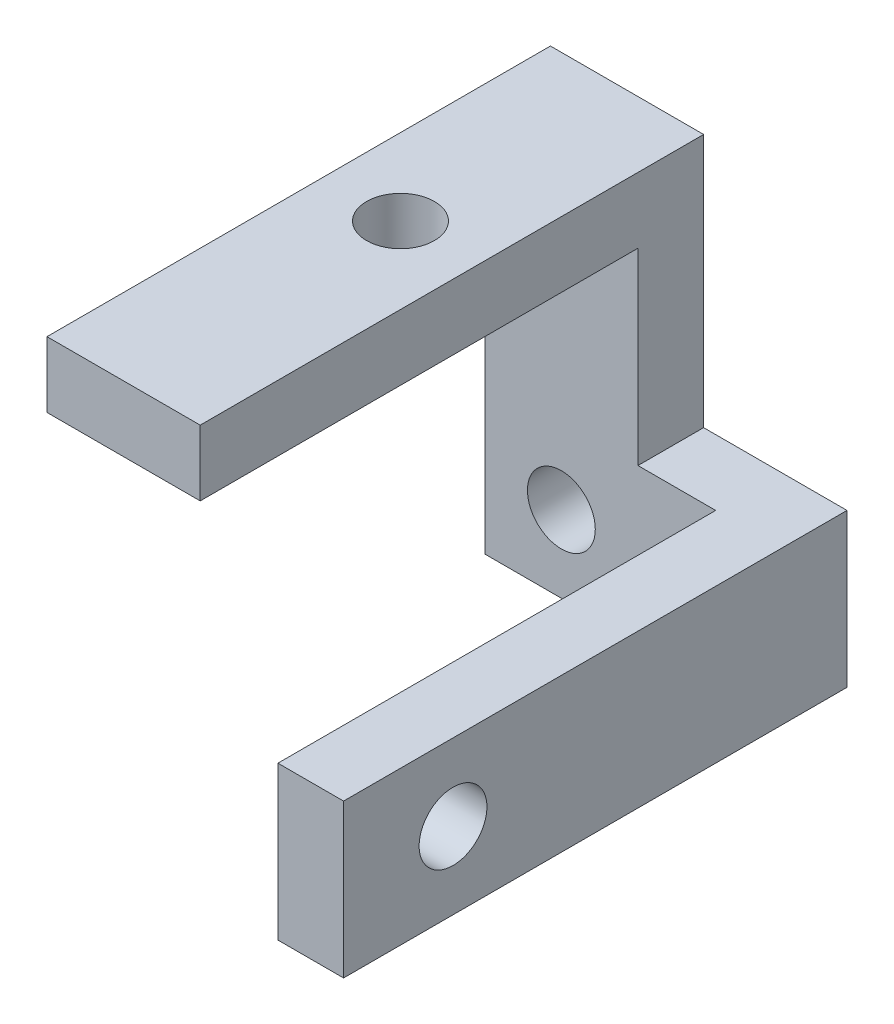
ISO-10303-21;
HEADER;
FILE_DESCRIPTION(('STEP AP214'),'2;1');
FILE_NAME('part.step','',(''),(''),'','','');
FILE_SCHEMA(('AUTOMOTIVE_DESIGN { 1 0 10303 214 1 1 1 1 }'));
ENDSEC;
DATA;
#1=APPLICATION_CONTEXT('core data for automotive mechanical design processes');
#2=APPLICATION_PROTOCOL_DEFINITION('international standard','automotive_design',2000,#1);
#3=PRODUCT_CONTEXT('',#1,'mechanical');
#4=PRODUCT('Part','Part','',(#3));
#5=PRODUCT_RELATED_PRODUCT_CATEGORY('part','',(#4));
#6=PRODUCT_DEFINITION_FORMATION('','',#4);
#7=PRODUCT_DEFINITION_CONTEXT('part definition',#1,'design');
#8=PRODUCT_DEFINITION('design','',#6,#7);
#9=PRODUCT_DEFINITION_SHAPE('','',#8);
#10=(LENGTH_UNIT() NAMED_UNIT(*) SI_UNIT(.MILLI.,.METRE.));
#11=(NAMED_UNIT(*) PLANE_ANGLE_UNIT() SI_UNIT($,.RADIAN.));
#12=(NAMED_UNIT(*) SI_UNIT($,.STERADIAN.) SOLID_ANGLE_UNIT());
#13=UNCERTAINTY_MEASURE_WITH_UNIT(LENGTH_MEASURE(1.E-05),#10,'distance_accuracy_value','');
#14=(GEOMETRIC_REPRESENTATION_CONTEXT(3) GLOBAL_UNCERTAINTY_ASSIGNED_CONTEXT((#13)) GLOBAL_UNIT_ASSIGNED_CONTEXT((#10,
#11,#12)) REPRESENTATION_CONTEXT('',''));
#15=CARTESIAN_POINT('',(0.,0.,0.));
#16=DIRECTION('',(0.,0.,1.));
#17=DIRECTION('',(1.,0.,0.));
#18=AXIS2_PLACEMENT_3D('',#15,#16,#17);
#19=CARTESIAN_POINT('',(0.,0.,3.));
#20=DIRECTION('',(0.,0.,1.));
#21=DIRECTION('',(1.,0.,0.));
#22=AXIS2_PLACEMENT_3D('',#19,#20,#21);
#23=PLANE('',#22);
#24=CARTESIAN_POINT('',(3.5,3.5,3.));
#25=DIRECTION('',(0.,0.,1.));
#26=DIRECTION('',(1.,0.,0.));
#27=AXIS2_PLACEMENT_3D('',#24,#25,#26);
#28=CIRCLE('',#27,1.55);
#29=CARTESIAN_POINT('',(5.05,3.5,3.));
#30=VERTEX_POINT('',#29);
#31=EDGE_CURVE('E384',#30,#30,#28,.T.);
#32=ORIENTED_EDGE('',*,*,#31,.F.);
#33=EDGE_LOOP('',(#32));
#34=FACE_BOUND('',#33,.T.);
#35=DIRECTION('',(1.,0.,0.));
#36=VECTOR('',#35,1.);
#37=CARTESIAN_POINT('',(0.,0.,3.));
#38=LINE('',#37,#36);
#39=CARTESIAN_POINT('',(0.,0.,3.));
#40=VERTEX_POINT('',#39);
#41=CARTESIAN_POINT('',(10.55,0.,3.));
#42=VERTEX_POINT('',#41);
#43=EDGE_CURVE('E56',#40,#42,#38,.T.);
#44=ORIENTED_EDGE('',*,*,#43,.T.);
#45=DIRECTION('',(0.,-1.,0.));
#46=VECTOR('',#45,1.);
#47=CARTESIAN_POINT('',(10.55,7.,3.));
#48=LINE('',#47,#46);
#49=CARTESIAN_POINT('',(10.55,7.,3.));
#50=VERTEX_POINT('',#49);
#51=EDGE_CURVE('E51',#50,#42,#48,.T.);
#52=ORIENTED_EDGE('',*,*,#51,.F.);
#53=DIRECTION('',(1.,0.,0.));
#54=VECTOR('',#53,1.);
#55=CARTESIAN_POINT('',(0.,7.,3.));
#56=LINE('',#55,#54);
#57=CARTESIAN_POINT('',(7.,7.,3.));
#58=VERTEX_POINT('',#57);
#59=EDGE_CURVE('E175',#58,#50,#56,.T.);
#60=ORIENTED_EDGE('',*,*,#59,.F.);
#61=DIRECTION('',(0.,1.,0.));
#62=VECTOR('',#61,1.);
#63=CARTESIAN_POINT('',(7.,0.,3.));
#64=LINE('',#63,#62);
#65=CARTESIAN_POINT('',(7.,15.6,3.));
#66=VERTEX_POINT('',#65);
#67=EDGE_CURVE('E177',#58,#66,#64,.T.);
#68=ORIENTED_EDGE('',*,*,#67,.T.);
#69=DIRECTION('',(1.,0.,0.));
#70=VECTOR('',#69,1.);
#71=CARTESIAN_POINT('',(0.,15.6,3.));
#72=LINE('',#71,#70);
#73=CARTESIAN_POINT('',(0.,15.6,3.));
#74=VERTEX_POINT('',#73);
#75=EDGE_CURVE('E149',#74,#66,#72,.T.);
#76=ORIENTED_EDGE('',*,*,#75,.F.);
#77=DIRECTION('',(0.,1.,0.));
#78=VECTOR('',#77,1.);
#79=CARTESIAN_POINT('',(0.,0.,3.));
#80=LINE('',#79,#78);
#81=EDGE_CURVE('E170',#40,#74,#80,.T.);
#82=ORIENTED_EDGE('',*,*,#81,.F.);
#83=EDGE_LOOP('',(#44,#52,#60,#68,#76,#82));
#84=FACE_BOUND('',#83,.T.);
#85=ADVANCED_FACE('F35',(#34,#84),#23,.T.);
#86=CARTESIAN_POINT('',(0.,0.,3.));
#87=DIRECTION('',(-1.,0.,0.));
#88=DIRECTION('',(0.,0.,1.));
#89=AXIS2_PLACEMENT_3D('',#86,#87,#88);
#90=PLANE('',#89);
#91=DIRECTION('',(0.,1.,0.));
#92=VECTOR('',#91,1.);
#93=CARTESIAN_POINT('',(0.,0.,0.));
#94=LINE('',#93,#92);
#95=CARTESIAN_POINT('',(0.,0.,0.));
#96=VERTEX_POINT('',#95);
#97=CARTESIAN_POINT('',(0.,18.6,0.));
#98=VERTEX_POINT('',#97);
#99=EDGE_CURVE('E169',#96,#98,#94,.T.);
#100=ORIENTED_EDGE('',*,*,#99,.F.);
#101=DIRECTION('',(0.,0.,-1.));
#102=VECTOR('',#101,1.);
#103=CARTESIAN_POINT('',(0.,0.,3.));
#104=LINE('',#103,#102);
#105=EDGE_CURVE('E11',#40,#96,#104,.T.);
#106=ORIENTED_EDGE('',*,*,#105,.F.);
#107=ORIENTED_EDGE('',*,*,#81,.T.);
#108=DIRECTION('',(0.,0.,-1.));
#109=VECTOR('',#108,1.);
#110=CARTESIAN_POINT('',(0.,15.6,23.));
#111=LINE('',#110,#109);
#112=CARTESIAN_POINT('',(0.,15.6,23.));
#113=VERTEX_POINT('',#112);
#114=EDGE_CURVE('E166',#113,#74,#111,.T.);
#115=ORIENTED_EDGE('',*,*,#114,.F.);
#116=DIRECTION('',(0.,-1.,0.));
#117=VECTOR('',#116,1.);
#118=CARTESIAN_POINT('',(0.,18.6,23.));
#119=LINE('',#118,#117);
#120=CARTESIAN_POINT('',(0.,18.6,23.));
#121=VERTEX_POINT('',#120);
#122=EDGE_CURVE('E150',#121,#113,#119,.T.);
#123=ORIENTED_EDGE('',*,*,#122,.F.);
#124=DIRECTION('',(0.,0.,-1.));
#125=VECTOR('',#124,1.);
#126=CARTESIAN_POINT('',(0.,18.6,3.));
#127=LINE('',#126,#125);
#128=EDGE_CURVE('E179',#121,#98,#127,.T.);
#129=ORIENTED_EDGE('',*,*,#128,.T.);
#130=EDGE_LOOP('',(#100,#106,#107,#115,#123,#129));
#131=FACE_BOUND('',#130,.T.);
#132=ADVANCED_FACE('F37',(#131),#90,.T.);
#133=CARTESIAN_POINT('',(0.,0.,3.));
#134=DIRECTION('',(0.,1.,0.));
#135=DIRECTION('',(0.,0.,1.));
#136=AXIS2_PLACEMENT_3D('',#133,#134,#135);
#137=PLANE('',#136);
#138=DIRECTION('',(1.,0.,0.));
#139=VECTOR('',#138,1.);
#140=CARTESIAN_POINT('',(0.,0.,0.));
#141=LINE('',#140,#139);
#142=CARTESIAN_POINT('',(13.55,0.,0.));
#143=VERTEX_POINT('',#142);
#144=EDGE_CURVE('E182',#96,#143,#141,.T.);
#145=ORIENTED_EDGE('',*,*,#144,.T.);
#146=DIRECTION('',(0.,0.,-1.));
#147=VECTOR('',#146,1.);
#148=CARTESIAN_POINT('',(13.55,0.,3.));
#149=LINE('',#148,#147);
#150=CARTESIAN_POINT('',(13.55,0.,23.));
#151=VERTEX_POINT('',#150);
#152=EDGE_CURVE('E44',#151,#143,#149,.T.);
#153=ORIENTED_EDGE('',*,*,#152,.F.);
#154=DIRECTION('',(1.,0.,0.));
#155=VECTOR('',#154,1.);
#156=CARTESIAN_POINT('',(13.55,0.,23.));
#157=LINE('',#156,#155);
#158=CARTESIAN_POINT('',(10.55,0.,23.));
#159=VERTEX_POINT('',#158);
#160=EDGE_CURVE('E136',#159,#151,#157,.T.);
#161=ORIENTED_EDGE('',*,*,#160,.F.);
#162=DIRECTION('',(0.,0.,-1.));
#163=VECTOR('',#162,1.);
#164=CARTESIAN_POINT('',(10.55,0.,23.));
#165=LINE('',#164,#163);
#166=EDGE_CURVE('E144',#159,#42,#165,.T.);
#167=ORIENTED_EDGE('',*,*,#166,.T.);
#168=ORIENTED_EDGE('',*,*,#43,.F.);
#169=ORIENTED_EDGE('',*,*,#105,.T.);
#170=EDGE_LOOP('',(#145,#153,#161,#167,#168,#169));
#171=FACE_BOUND('',#170,.T.);
#172=ADVANCED_FACE('F199',(#171),#137,.F.);
#173=CARTESIAN_POINT('',(13.55,0.,3.));
#174=DIRECTION('',(1.,0.,0.));
#175=DIRECTION('',(0.,1.,0.));
#176=AXIS2_PLACEMENT_3D('',#173,#174,#175);
#177=PLANE('',#176);
#178=CARTESIAN_POINT('',(13.55,3.5,18.));
#179=DIRECTION('',(1.,0.,0.));
#180=DIRECTION('',(0.,1.,0.));
#181=AXIS2_PLACEMENT_3D('',#178,#179,#180);
#182=CIRCLE('',#181,1.55);
#183=CARTESIAN_POINT('',(13.55,5.05,18.));
#184=VERTEX_POINT('',#183);
#185=EDGE_CURVE('E389',#184,#184,#182,.T.);
#186=ORIENTED_EDGE('',*,*,#185,.F.);
#187=EDGE_LOOP('',(#186));
#188=FACE_BOUND('',#187,.T.);
#189=DIRECTION('',(0.,-1.,0.));
#190=VECTOR('',#189,1.);
#191=CARTESIAN_POINT('',(13.55,0.,0.));
#192=LINE('',#191,#190);
#193=CARTESIAN_POINT('',(13.55,7.,0.));
#194=VERTEX_POINT('',#193);
#195=EDGE_CURVE('E118',#194,#143,#192,.T.);
#196=ORIENTED_EDGE('',*,*,#195,.F.);
#197=DIRECTION('',(0.,0.,-1.));
#198=VECTOR('',#197,1.);
#199=CARTESIAN_POINT('',(13.55,7.,3.));
#200=LINE('',#199,#198);
#201=CARTESIAN_POINT('',(13.55,7.,23.));
#202=VERTEX_POINT('',#201);
#203=EDGE_CURVE('E112',#202,#194,#200,.T.);
#204=ORIENTED_EDGE('',*,*,#203,.F.);
#205=DIRECTION('',(0.,1.,0.));
#206=VECTOR('',#205,1.);
#207=CARTESIAN_POINT('',(13.55,7.,23.));
#208=LINE('',#207,#206);
#209=EDGE_CURVE('E116',#151,#202,#208,.T.);
#210=ORIENTED_EDGE('',*,*,#209,.F.);
#211=ORIENTED_EDGE('',*,*,#152,.T.);
#212=EDGE_LOOP('',(#196,#204,#210,#211));
#213=FACE_BOUND('',#212,.T.);
#214=ADVANCED_FACE('F114',(#188,#213),#177,.T.);
#215=CARTESIAN_POINT('',(0.,7.,3.));
#216=DIRECTION('',(0.,1.,0.));
#217=DIRECTION('',(0.,0.,1.));
#218=AXIS2_PLACEMENT_3D('',#215,#216,#217);
#219=PLANE('',#218);
#220=DIRECTION('',(1.,0.,0.));
#221=VECTOR('',#220,1.);
#222=CARTESIAN_POINT('',(0.,7.,0.));
#223=LINE('',#222,#221);
#224=CARTESIAN_POINT('',(7.,7.,0.));
#225=VERTEX_POINT('',#224);
#226=EDGE_CURVE('E186',#225,#194,#223,.T.);
#227=ORIENTED_EDGE('',*,*,#226,.F.);
#228=DIRECTION('',(0.,0.,-1.));
#229=VECTOR('',#228,1.);
#230=CARTESIAN_POINT('',(7.,7.,3.));
#231=LINE('',#230,#229);
#232=EDGE_CURVE('E122',#58,#225,#231,.T.);
#233=ORIENTED_EDGE('',*,*,#232,.F.);
#234=ORIENTED_EDGE('',*,*,#59,.T.);
#235=DIRECTION('',(0.,0.,-1.));
#236=VECTOR('',#235,1.);
#237=CARTESIAN_POINT('',(10.55,7.,23.));
#238=LINE('',#237,#236);
#239=CARTESIAN_POINT('',(10.55,7.,23.));
#240=VERTEX_POINT('',#239);
#241=EDGE_CURVE('E128',#240,#50,#238,.T.);
#242=ORIENTED_EDGE('',*,*,#241,.F.);
#243=DIRECTION('',(-1.,0.,0.));
#244=VECTOR('',#243,1.);
#245=CARTESIAN_POINT('',(13.55,7.,23.));
#246=LINE('',#245,#244);
#247=EDGE_CURVE('E125',#202,#240,#246,.T.);
#248=ORIENTED_EDGE('',*,*,#247,.F.);
#249=ORIENTED_EDGE('',*,*,#203,.T.);
#250=EDGE_LOOP('',(#227,#233,#234,#242,#248,#249));
#251=FACE_BOUND('',#250,.T.);
#252=ADVANCED_FACE('F126',(#251),#219,.T.);
#253=CARTESIAN_POINT('',(7.,0.,3.));
#254=DIRECTION('',(-1.,0.,0.));
#255=DIRECTION('',(0.,0.,1.));
#256=AXIS2_PLACEMENT_3D('',#253,#254,#255);
#257=PLANE('',#256);
#258=DIRECTION('',(0.,1.,0.));
#259=VECTOR('',#258,1.);
#260=CARTESIAN_POINT('',(7.,0.,0.));
#261=LINE('',#260,#259);
#262=CARTESIAN_POINT('',(7.,18.6,0.));
#263=VERTEX_POINT('',#262);
#264=EDGE_CURVE('E188',#225,#263,#261,.T.);
#265=ORIENTED_EDGE('',*,*,#264,.T.);
#266=DIRECTION('',(0.,0.,-1.));
#267=VECTOR('',#266,1.);
#268=CARTESIAN_POINT('',(7.,18.6,3.));
#269=LINE('',#268,#267);
#270=CARTESIAN_POINT('',(7.,18.6,23.));
#271=VERTEX_POINT('',#270);
#272=EDGE_CURVE('E194',#271,#263,#269,.T.);
#273=ORIENTED_EDGE('',*,*,#272,.F.);
#274=DIRECTION('',(0.,1.,0.));
#275=VECTOR('',#274,1.);
#276=CARTESIAN_POINT('',(7.,18.6,23.));
#277=LINE('',#276,#275);
#278=CARTESIAN_POINT('',(7.,15.6,23.));
#279=VERTEX_POINT('',#278);
#280=EDGE_CURVE('E155',#279,#271,#277,.T.);
#281=ORIENTED_EDGE('',*,*,#280,.F.);
#282=DIRECTION('',(0.,0.,-1.));
#283=VECTOR('',#282,1.);
#284=CARTESIAN_POINT('',(7.,15.6,23.));
#285=LINE('',#284,#283);
#286=EDGE_CURVE('E161',#279,#66,#285,.T.);
#287=ORIENTED_EDGE('',*,*,#286,.T.);
#288=ORIENTED_EDGE('',*,*,#67,.F.);
#289=ORIENTED_EDGE('',*,*,#232,.T.);
#290=EDGE_LOOP('',(#265,#273,#281,#287,#288,#289));
#291=FACE_BOUND('',#290,.T.);
#292=ADVANCED_FACE('F206',(#291),#257,.F.);
#293=CARTESIAN_POINT('',(0.,18.6,3.));
#294=DIRECTION('',(0.,1.,0.));
#295=DIRECTION('',(0.,0.,1.));
#296=AXIS2_PLACEMENT_3D('',#293,#294,#295);
#297=PLANE('',#296);
#298=CARTESIAN_POINT('',(3.5,18.6,10.35));
#299=DIRECTION('',(0.,1.,0.));
#300=DIRECTION('',(0.,0.,1.));
#301=AXIS2_PLACEMENT_3D('',#298,#299,#300);
#302=CIRCLE('',#301,1.55);
#303=CARTESIAN_POINT('',(3.5,18.6,11.9));
#304=VERTEX_POINT('',#303);
#305=EDGE_CURVE('E138',#304,#304,#302,.T.);
#306=ORIENTED_EDGE('',*,*,#305,.F.);
#307=EDGE_LOOP('',(#306));
#308=FACE_BOUND('',#307,.T.);
#309=DIRECTION('',(1.,0.,0.));
#310=VECTOR('',#309,1.);
#311=CARTESIAN_POINT('',(0.,18.6,0.));
#312=LINE('',#311,#310);
#313=EDGE_CURVE('E173',#98,#263,#312,.T.);
#314=ORIENTED_EDGE('',*,*,#313,.F.);
#315=ORIENTED_EDGE('',*,*,#128,.F.);
#316=DIRECTION('',(-1.,0.,0.));
#317=VECTOR('',#316,1.);
#318=CARTESIAN_POINT('',(0.,18.6,23.));
#319=LINE('',#318,#317);
#320=EDGE_CURVE('E158',#271,#121,#319,.T.);
#321=ORIENTED_EDGE('',*,*,#320,.F.);
#322=ORIENTED_EDGE('',*,*,#272,.T.);
#323=EDGE_LOOP('',(#314,#315,#321,#322));
#324=FACE_BOUND('',#323,.T.);
#325=ADVANCED_FACE('F223',(#308,#324),#297,.T.);
#326=CARTESIAN_POINT('',(0.,0.,0.));
#327=DIRECTION('',(0.,0.,1.));
#328=DIRECTION('',(1.,0.,0.));
#329=AXIS2_PLACEMENT_3D('',#326,#327,#328);
#330=PLANE('',#329);
#331=CARTESIAN_POINT('',(3.5,3.5,0.));
#332=DIRECTION('',(0.,0.,1.));
#333=DIRECTION('',(1.,0.,0.));
#334=AXIS2_PLACEMENT_3D('',#331,#332,#333);
#335=CIRCLE('',#334,1.55);
#336=CARTESIAN_POINT('',(5.05,3.5,0.));
#337=VERTEX_POINT('',#336);
#338=EDGE_CURVE('E39',#337,#337,#335,.T.);
#339=ORIENTED_EDGE('',*,*,#338,.T.);
#340=EDGE_LOOP('',(#339));
#341=FACE_BOUND('',#340,.T.);
#342=ORIENTED_EDGE('',*,*,#99,.T.);
#343=ORIENTED_EDGE('',*,*,#313,.T.);
#344=ORIENTED_EDGE('',*,*,#264,.F.);
#345=ORIENTED_EDGE('',*,*,#226,.T.);
#346=ORIENTED_EDGE('',*,*,#195,.T.);
#347=ORIENTED_EDGE('',*,*,#144,.F.);
#348=EDGE_LOOP('',(#342,#343,#344,#345,#346,#347));
#349=FACE_BOUND('',#348,.T.);
#350=ADVANCED_FACE('F202',(#341,#349),#330,.F.);
#351=CARTESIAN_POINT('',(0.,15.6,23.));
#352=DIRECTION('',(0.,1.,0.));
#353=DIRECTION('',(0.,0.,1.));
#354=AXIS2_PLACEMENT_3D('',#351,#352,#353);
#355=PLANE('',#354);
#356=CARTESIAN_POINT('',(3.5,15.6,10.35));
#357=DIRECTION('',(0.,-1.,0.));
#358=DIRECTION('',(0.,0.,-1.));
#359=AXIS2_PLACEMENT_3D('',#356,#357,#358);
#360=CIRCLE('',#359,1.55);
#361=CARTESIAN_POINT('',(3.5,15.6,8.8));
#362=VERTEX_POINT('',#361);
#363=EDGE_CURVE('E394',#362,#362,#360,.T.);
#364=ORIENTED_EDGE('',*,*,#363,.F.);
#365=EDGE_LOOP('',(#364));
#366=FACE_BOUND('',#365,.T.);
#367=ORIENTED_EDGE('',*,*,#75,.T.);
#368=ORIENTED_EDGE('',*,*,#286,.F.);
#369=DIRECTION('',(1.,0.,0.));
#370=VECTOR('',#369,1.);
#371=CARTESIAN_POINT('',(0.,15.6,23.));
#372=LINE('',#371,#370);
#373=EDGE_CURVE('E153',#113,#279,#372,.T.);
#374=ORIENTED_EDGE('',*,*,#373,.F.);
#375=ORIENTED_EDGE('',*,*,#114,.T.);
#376=EDGE_LOOP('',(#367,#368,#374,#375));
#377=FACE_BOUND('',#376,.T.);
#378=ADVANCED_FACE('F219',(#366,#377),#355,.F.);
#379=CARTESIAN_POINT('',(0.,0.,23.));
#380=DIRECTION('',(0.,0.,1.));
#381=DIRECTION('',(1.,0.,0.));
#382=AXIS2_PLACEMENT_3D('',#379,#380,#381);
#383=PLANE('',#382);
#384=ORIENTED_EDGE('',*,*,#122,.T.);
#385=ORIENTED_EDGE('',*,*,#373,.T.);
#386=ORIENTED_EDGE('',*,*,#280,.T.);
#387=ORIENTED_EDGE('',*,*,#320,.T.);
#388=EDGE_LOOP('',(#384,#385,#386,#387));
#389=FACE_BOUND('',#388,.T.);
#390=ADVANCED_FACE('F270',(#389),#383,.T.);
#391=CARTESIAN_POINT('',(10.55,7.,23.));
#392=DIRECTION('',(1.,0.,0.));
#393=DIRECTION('',(0.,0.,-1.));
#394=AXIS2_PLACEMENT_3D('',#391,#392,#393);
#395=PLANE('',#394);
#396=CARTESIAN_POINT('',(10.55,3.5,18.));
#397=DIRECTION('',(-1.,0.,0.));
#398=DIRECTION('',(0.,0.,1.));
#399=AXIS2_PLACEMENT_3D('',#396,#397,#398);
#400=CIRCLE('',#399,1.55);
#401=CARTESIAN_POINT('',(10.55,3.5,19.55));
#402=VERTEX_POINT('',#401);
#403=EDGE_CURVE('E387',#402,#402,#400,.T.);
#404=ORIENTED_EDGE('',*,*,#403,.F.);
#405=EDGE_LOOP('',(#404));
#406=FACE_BOUND('',#405,.T.);
#407=ORIENTED_EDGE('',*,*,#51,.T.);
#408=ORIENTED_EDGE('',*,*,#166,.F.);
#409=DIRECTION('',(0.,-1.,0.));
#410=VECTOR('',#409,1.);
#411=CARTESIAN_POINT('',(10.55,7.,23.));
#412=LINE('',#411,#410);
#413=EDGE_CURVE('E131',#240,#159,#412,.T.);
#414=ORIENTED_EDGE('',*,*,#413,.F.);
#415=ORIENTED_EDGE('',*,*,#241,.T.);
#416=EDGE_LOOP('',(#407,#408,#414,#415));
#417=FACE_BOUND('',#416,.T.);
#418=ADVANCED_FACE('F276',(#406,#417),#395,.F.);
#419=CARTESIAN_POINT('',(0.,0.,23.));
#420=DIRECTION('',(0.,0.,-1.));
#421=DIRECTION('',(-1.,0.,0.));
#422=AXIS2_PLACEMENT_3D('',#419,#420,#421);
#423=PLANE('',#422);
#424=ORIENTED_EDGE('',*,*,#209,.T.);
#425=ORIENTED_EDGE('',*,*,#247,.T.);
#426=ORIENTED_EDGE('',*,*,#413,.T.);
#427=ORIENTED_EDGE('',*,*,#160,.T.);
#428=EDGE_LOOP('',(#424,#425,#426,#427));
#429=FACE_BOUND('',#428,.T.);
#430=ADVANCED_FACE('F134',(#429),#423,.F.);
#431=CARTESIAN_POINT('',(3.5,35.6,10.35));
#432=DIRECTION('',(0.,-1.,0.));
#433=DIRECTION('',(0.,0.,-1.));
#434=AXIS2_PLACEMENT_3D('',#431,#432,#433);
#435=CYLINDRICAL_SURFACE('',#434,1.55);
#436=ORIENTED_EDGE('',*,*,#305,.T.);
#437=EDGE_LOOP('',(#436));
#438=FACE_BOUND('',#437,.T.);
#439=ORIENTED_EDGE('',*,*,#363,.T.);
#440=EDGE_LOOP('',(#439));
#441=FACE_BOUND('',#440,.T.);
#442=ADVANCED_FACE('F289',(#438,#441),#435,.F.);
#443=CARTESIAN_POINT('',(30.55,3.5,18.));
#444=DIRECTION('',(-1.,0.,0.));
#445=DIRECTION('',(0.,0.,1.));
#446=AXIS2_PLACEMENT_3D('',#443,#444,#445);
#447=CYLINDRICAL_SURFACE('',#446,1.55);
#448=ORIENTED_EDGE('',*,*,#185,.T.);
#449=EDGE_LOOP('',(#448));
#450=FACE_BOUND('',#449,.T.);
#451=ORIENTED_EDGE('',*,*,#403,.T.);
#452=EDGE_LOOP('',(#451));
#453=FACE_BOUND('',#452,.T.);
#454=ADVANCED_FACE('F295',(#450,#453),#447,.F.);
#455=CARTESIAN_POINT('',(3.5,3.5,-17.));
#456=DIRECTION('',(0.,0.,1.));
#457=DIRECTION('',(1.,0.,0.));
#458=AXIS2_PLACEMENT_3D('',#455,#456,#457);
#459=CYLINDRICAL_SURFACE('',#458,1.55);
#460=ORIENTED_EDGE('',*,*,#31,.T.);
#461=EDGE_LOOP('',(#460));
#462=FACE_BOUND('',#461,.T.);
#463=ORIENTED_EDGE('',*,*,#338,.F.);
#464=EDGE_LOOP('',(#463));
#465=FACE_BOUND('',#464,.T.);
#466=ADVANCED_FACE('F302',(#462,#465),#459,.F.);
#467=CLOSED_SHELL('',(#85,#132,#172,#214,#252,#292,#325,#350,#378,#390,#418,#430,#442,#454,#466));
#468=MANIFOLD_SOLID_BREP('B2',#467);
#469=ADVANCED_BREP_SHAPE_REPRESENTATION('',(#18,#468),#14);
#470=SHAPE_DEFINITION_REPRESENTATION(#9,#469);
ENDSEC;
END-ISO-10303-21;
